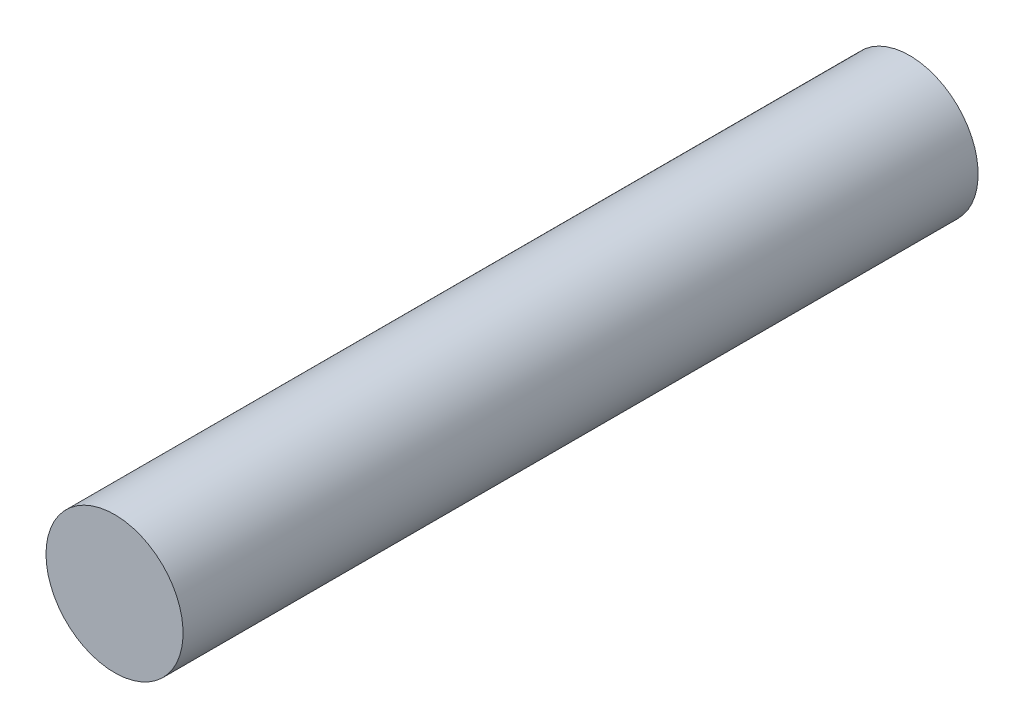
ISO-10303-21;
HEADER;
FILE_DESCRIPTION(('STEP AP214'),'2;1');
FILE_NAME('part.step','',(''),(''),'','','');
FILE_SCHEMA(('AUTOMOTIVE_DESIGN { 1 0 10303 214 1 1 1 1 }'));
ENDSEC;
DATA;
#1=APPLICATION_CONTEXT('core data for automotive mechanical design processes');
#2=APPLICATION_PROTOCOL_DEFINITION('international standard','automotive_design',2000,#1);
#3=PRODUCT_CONTEXT('',#1,'mechanical');
#4=PRODUCT('Part','Part','',(#3));
#5=PRODUCT_RELATED_PRODUCT_CATEGORY('part','',(#4));
#6=PRODUCT_DEFINITION_FORMATION('','',#4);
#7=PRODUCT_DEFINITION_CONTEXT('part definition',#1,'design');
#8=PRODUCT_DEFINITION('design','',#6,#7);
#9=PRODUCT_DEFINITION_SHAPE('','',#8);
#10=(LENGTH_UNIT() NAMED_UNIT(*) SI_UNIT(.MILLI.,.METRE.));
#11=(NAMED_UNIT(*) PLANE_ANGLE_UNIT() SI_UNIT($,.RADIAN.));
#12=(NAMED_UNIT(*) SI_UNIT($,.STERADIAN.) SOLID_ANGLE_UNIT());
#13=UNCERTAINTY_MEASURE_WITH_UNIT(LENGTH_MEASURE(1.E-05),#10,'distance_accuracy_value','');
#14=(GEOMETRIC_REPRESENTATION_CONTEXT(3) GLOBAL_UNCERTAINTY_ASSIGNED_CONTEXT((#13)) GLOBAL_UNIT_ASSIGNED_CONTEXT((#10,
#11,#12)) REPRESENTATION_CONTEXT('',''));
#15=CARTESIAN_POINT('',(0.,0.,0.));
#16=DIRECTION('',(0.,0.,1.));
#17=DIRECTION('',(1.,0.,0.));
#18=AXIS2_PLACEMENT_3D('',#15,#16,#17);
#19=CARTESIAN_POINT('',(0.,0.,29.));
#20=DIRECTION('',(0.,0.,-1.));
#21=DIRECTION('',(-1.,0.,0.));
#22=AXIS2_PLACEMENT_3D('',#19,#20,#21);
#23=CYLINDRICAL_SURFACE('',#22,2.5);
#24=CARTESIAN_POINT('',(0.,0.,29.));
#25=DIRECTION('',(0.,0.,1.));
#26=DIRECTION('',(1.,0.,0.));
#27=AXIS2_PLACEMENT_3D('',#24,#25,#26);
#28=CIRCLE('',#27,2.5);
#29=CARTESIAN_POINT('',(-2.5,0.,29.));
#30=VERTEX_POINT('',#29);
#31=EDGE_CURVE('E10',#30,#30,#28,.T.);
#32=CARTESIAN_POINT('',(0.,0.,0.));
#33=DIRECTION('',(0.,0.,1.));
#34=DIRECTION('',(1.,0.,0.));
#35=AXIS2_PLACEMENT_3D('',#32,#33,#34);
#36=CIRCLE('',#35,2.5);
#37=CARTESIAN_POINT('',(-2.5,0.,0.));
#38=VERTEX_POINT('',#37);
#39=EDGE_CURVE('E40',#38,#38,#36,.T.);
#40=CARTESIAN_POINT('',(-2.5,0.,29.));
#41=CARTESIAN_POINT('',(-2.5,0.,28.6979166666667));
#42=CARTESIAN_POINT('',(-2.5,0.,28.3958333333333));
#43=CARTESIAN_POINT('',(-2.5,0.,27.7916666666667));
#44=CARTESIAN_POINT('',(-2.5,0.,27.4895833333333));
#45=CARTESIAN_POINT('',(-2.5,0.,26.8854166666667));
#46=CARTESIAN_POINT('',(-2.5,0.,26.5833333333333));
#47=CARTESIAN_POINT('',(-2.5,0.,25.9791666666667));
#48=CARTESIAN_POINT('',(-2.5,0.,25.6770833333333));
#49=CARTESIAN_POINT('',(-2.5,0.,25.0729166666667));
#50=CARTESIAN_POINT('',(-2.5,0.,24.7708333333333));
#51=CARTESIAN_POINT('',(-2.5,0.,24.1666666666667));
#52=CARTESIAN_POINT('',(-2.5,0.,23.8645833333333));
#53=CARTESIAN_POINT('',(-2.5,0.,23.2604166666667));
#54=CARTESIAN_POINT('',(-2.5,0.,22.9583333333333));
#55=CARTESIAN_POINT('',(-2.5,0.,22.3541666666667));
#56=CARTESIAN_POINT('',(-2.5,0.,22.0520833333333));
#57=CARTESIAN_POINT('',(-2.5,0.,21.4479166666667));
#58=CARTESIAN_POINT('',(-2.5,0.,21.1458333333333));
#59=CARTESIAN_POINT('',(-2.5,0.,20.5416666666667));
#60=CARTESIAN_POINT('',(-2.5,0.,20.2395833333333));
#61=CARTESIAN_POINT('',(-2.5,0.,19.6354166666667));
#62=CARTESIAN_POINT('',(-2.5,0.,19.3333333333333));
#63=CARTESIAN_POINT('',(-2.5,0.,18.7291666666667));
#64=CARTESIAN_POINT('',(-2.5,0.,18.4270833333333));
#65=CARTESIAN_POINT('',(-2.5,0.,17.8229166666667));
#66=CARTESIAN_POINT('',(-2.5,0.,17.5208333333333));
#67=CARTESIAN_POINT('',(-2.5,0.,16.9166666666667));
#68=CARTESIAN_POINT('',(-2.5,0.,16.6145833333333));
#69=CARTESIAN_POINT('',(-2.5,0.,16.0104166666667));
#70=CARTESIAN_POINT('',(-2.5,0.,15.7083333333333));
#71=CARTESIAN_POINT('',(-2.5,0.,15.1041666666667));
#72=CARTESIAN_POINT('',(-2.5,0.,14.8020833333333));
#73=CARTESIAN_POINT('',(-2.5,0.,14.1979166666667));
#74=CARTESIAN_POINT('',(-2.5,0.,13.8958333333333));
#75=CARTESIAN_POINT('',(-2.5,0.,13.2916666666667));
#76=CARTESIAN_POINT('',(-2.5,0.,12.9895833333333));
#77=CARTESIAN_POINT('',(-2.5,0.,12.3854166666667));
#78=CARTESIAN_POINT('',(-2.5,0.,12.0833333333333));
#79=CARTESIAN_POINT('',(-2.5,0.,11.4791666666667));
#80=CARTESIAN_POINT('',(-2.5,0.,11.1770833333333));
#81=CARTESIAN_POINT('',(-2.5,0.,10.5729166666667));
#82=CARTESIAN_POINT('',(-2.5,0.,10.2708333333333));
#83=CARTESIAN_POINT('',(-2.5,0.,9.66666666666667));
#84=CARTESIAN_POINT('',(-2.5,0.,9.36458333333333));
#85=CARTESIAN_POINT('',(-2.5,0.,8.76041666666667));
#86=CARTESIAN_POINT('',(-2.5,0.,8.45833333333333));
#87=CARTESIAN_POINT('',(-2.5,0.,7.85416666666667));
#88=CARTESIAN_POINT('',(-2.5,0.,7.55208333333333));
#89=CARTESIAN_POINT('',(-2.5,0.,6.94791666666667));
#90=CARTESIAN_POINT('',(-2.5,0.,6.64583333333333));
#91=CARTESIAN_POINT('',(-2.5,0.,6.04166666666667));
#92=CARTESIAN_POINT('',(-2.5,0.,5.73958333333333));
#93=CARTESIAN_POINT('',(-2.5,0.,5.13541666666667));
#94=CARTESIAN_POINT('',(-2.5,0.,4.83333333333333));
#95=CARTESIAN_POINT('',(-2.5,0.,4.22916666666667));
#96=CARTESIAN_POINT('',(-2.5,0.,3.92708333333333));
#97=CARTESIAN_POINT('',(-2.5,0.,3.32291666666667));
#98=CARTESIAN_POINT('',(-2.5,0.,3.02083333333333));
#99=CARTESIAN_POINT('',(-2.5,0.,2.41666666666667));
#100=CARTESIAN_POINT('',(-2.5,0.,2.11458333333333));
#101=CARTESIAN_POINT('',(-2.5,0.,1.51041666666667));
#102=CARTESIAN_POINT('',(-2.5,0.,1.20833333333333));
#103=CARTESIAN_POINT('',(-2.5,0.,0.604166666666667));
#104=CARTESIAN_POINT('',(-2.5,0.,0.302083333333333));
#105=CARTESIAN_POINT('',(-2.5,0.,0.));
#106=B_SPLINE_CURVE_WITH_KNOTS('',3,(#40,#41,#42,#43,#44,#45,#46,#47,#48,#49,#50,#51,#52,#53,
#54,#55,#56,#57,#58,#59,#60,#61,#62,#63,#64,#65,#66,#67,#68,#69,#70,#71,#72,#73,#74,#75,#76,#77,
#78,#79,#80,#81,#82,#83,#84,#85,#86,#87,#88,#89,#90,#91,#92,#93,#94,#95,#96,#97,#98,#99,#100,
#101,#102,#103,#104,#105),.UNSPECIFIED.,.F.,.F.,(4,2,2,2,2,2,2,2,2,2,2,2,2,2,2,2,2,2,2,2,2,2,2,
2,2,2,2,2,2,2,2,2,4),(0.,0.906249999999997,1.8125,2.71875,3.625,4.53125,5.4375,6.34375,7.25,
8.15625,9.0625,9.96875,10.875,11.78125,12.6875,13.59375,14.5,15.40625,16.3125,17.21875,18.125,
19.03125,19.9375,20.84375,21.75,22.65625,23.5625,24.46875,25.375,26.28125,27.1875,28.09375,29.),.UNSPECIFIED.);
#107=EDGE_CURVE('BSEAM37',#30,#38,#106,.T.);
#108=ORIENTED_EDGE('',*,*,#31,.F.);
#109=ORIENTED_EDGE('',*,*,#39,.T.);
#110=ORIENTED_EDGE('',*,*,#107,.T.);
#111=ORIENTED_EDGE('',*,*,#107,.F.);
#112=EDGE_LOOP('',(#108,#110,#109,#111));
#113=FACE_BOUND('',#112,.T.);
#114=ADVANCED_FACE('F37',(#113),#23,.T.);
#115=CARTESIAN_POINT('',(0.,0.,29.));
#116=DIRECTION('',(0.,0.,1.));
#117=DIRECTION('',(1.,0.,0.));
#118=AXIS2_PLACEMENT_3D('',#115,#116,#117);
#119=PLANE('',#118);
#120=ORIENTED_EDGE('',*,*,#31,.T.);
#121=EDGE_LOOP('',(#120));
#122=FACE_BOUND('',#121,.T.);
#123=ADVANCED_FACE('F52',(#122),#119,.T.);
#124=CARTESIAN_POINT('',(0.,0.,0.));
#125=DIRECTION('',(0.,0.,1.));
#126=DIRECTION('',(1.,0.,0.));
#127=AXIS2_PLACEMENT_3D('',#124,#125,#126);
#128=PLANE('',#127);
#129=ORIENTED_EDGE('',*,*,#39,.F.);
#130=EDGE_LOOP('',(#129));
#131=FACE_BOUND('',#130,.T.);
#132=ADVANCED_FACE('F50',(#131),#128,.F.);
#133=CLOSED_SHELL('',(#114,#123,#132));
#134=MANIFOLD_SOLID_BREP('B2',#133);
#135=ADVANCED_BREP_SHAPE_REPRESENTATION('',(#18,#134),#14);
#136=SHAPE_DEFINITION_REPRESENTATION(#9,#135);
ENDSEC;
END-ISO-10303-21;
